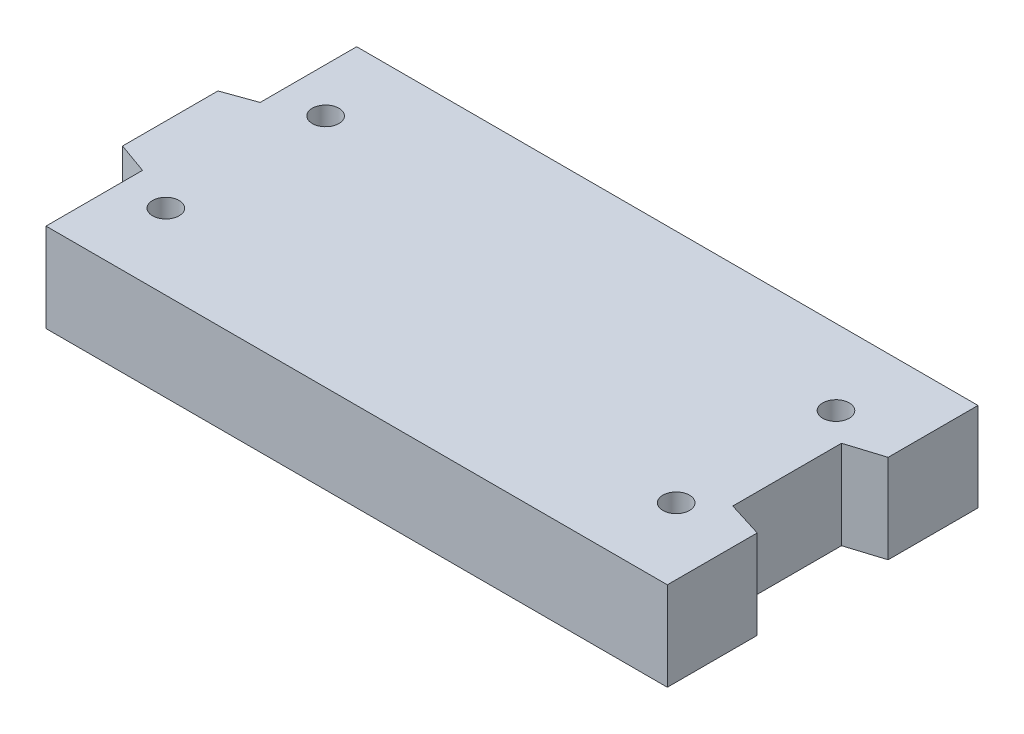
ISO-10303-21;
HEADER;
FILE_DESCRIPTION(('STEP AP214'),'2;1');
FILE_NAME('part.step','',(''),(''),'','','');
FILE_SCHEMA(('AUTOMOTIVE_DESIGN { 1 0 10303 214 1 1 1 1 }'));
ENDSEC;
DATA;
#1=APPLICATION_CONTEXT('core data for automotive mechanical design processes');
#2=APPLICATION_PROTOCOL_DEFINITION('international standard','automotive_design',2000,#1);
#3=PRODUCT_CONTEXT('',#1,'mechanical');
#4=PRODUCT('Part','Part','',(#3));
#5=PRODUCT_RELATED_PRODUCT_CATEGORY('part','',(#4));
#6=PRODUCT_DEFINITION_FORMATION('','',#4);
#7=PRODUCT_DEFINITION_CONTEXT('part definition',#1,'design');
#8=PRODUCT_DEFINITION('design','',#6,#7);
#9=PRODUCT_DEFINITION_SHAPE('','',#8);
#10=(LENGTH_UNIT() NAMED_UNIT(*) SI_UNIT(.MILLI.,.METRE.));
#11=(NAMED_UNIT(*) PLANE_ANGLE_UNIT() SI_UNIT($,.RADIAN.));
#12=(NAMED_UNIT(*) SI_UNIT($,.STERADIAN.) SOLID_ANGLE_UNIT());
#13=UNCERTAINTY_MEASURE_WITH_UNIT(LENGTH_MEASURE(1.E-05),#10,'distance_accuracy_value','');
#14=(GEOMETRIC_REPRESENTATION_CONTEXT(3) GLOBAL_UNCERTAINTY_ASSIGNED_CONTEXT((#13)) GLOBAL_UNIT_ASSIGNED_CONTEXT((#10,
#11,#12)) REPRESENTATION_CONTEXT('',''));
#15=CARTESIAN_POINT('',(0.,0.,0.));
#16=DIRECTION('',(0.,0.,1.));
#17=DIRECTION('',(1.,0.,0.));
#18=AXIS2_PLACEMENT_3D('',#15,#16,#17);
#19=CARTESIAN_POINT('',(115.347513913825,40.,24.5));
#20=DIRECTION('',(-0.298274993135947,0.,0.95447997803503));
#21=DIRECTION('',(0.95447997803503,0.,0.298274993135947));
#22=AXIS2_PLACEMENT_3D('',#19,#20,#21);
#23=PLANE('',#22);
#24=DIRECTION('',(-0.95447997803503,0.,-0.298274993135947));
#25=VECTOR('',#24,1.);
#26=CARTESIAN_POINT('',(115.347513913825,0.,24.5));
#27=LINE('',#26,#25);
#28=CARTESIAN_POINT('',(131.347513913825,0.,29.5));
#29=VERTEX_POINT('',#28);
#30=CARTESIAN_POINT('',(115.347513913825,0.,24.5));
#31=VERTEX_POINT('',#30);
#32=EDGE_CURVE('E166',#29,#31,#27,.T.);
#33=ORIENTED_EDGE('',*,*,#32,.T.);
#34=DIRECTION('',(0.,-1.,0.));
#35=VECTOR('',#34,1.);
#36=CARTESIAN_POINT('',(115.347513913825,40.,24.5));
#37=LINE('',#36,#35);
#38=CARTESIAN_POINT('',(115.347513913825,40.,24.5));
#39=VERTEX_POINT('',#38);
#40=EDGE_CURVE('E219',#39,#31,#37,.T.);
#41=ORIENTED_EDGE('',*,*,#40,.F.);
#42=DIRECTION('',(-0.95447997803503,0.,-0.298274993135947));
#43=VECTOR('',#42,1.);
#44=CARTESIAN_POINT('',(115.347513913825,40.,24.5));
#45=LINE('',#44,#43);
#46=CARTESIAN_POINT('',(131.347513913825,40.,29.5));
#47=VERTEX_POINT('',#46);
#48=EDGE_CURVE('E194',#47,#39,#45,.T.);
#49=ORIENTED_EDGE('',*,*,#48,.F.);
#50=DIRECTION('',(0.,-1.,0.));
#51=VECTOR('',#50,1.);
#52=CARTESIAN_POINT('',(131.347513913825,40.,29.5));
#53=LINE('',#52,#51);
#54=EDGE_CURVE('E162',#47,#29,#53,.T.);
#55=ORIENTED_EDGE('',*,*,#54,.T.);
#56=EDGE_LOOP('',(#33,#41,#49,#55));
#57=FACE_BOUND('',#56,.T.);
#58=ADVANCED_FACE('F41',(#57),#23,.F.);
#59=CARTESIAN_POINT('',(115.347513913825,40.,-24.5));
#60=DIRECTION('',(-1.,0.,0.));
#61=DIRECTION('',(0.,0.,1.));
#62=AXIS2_PLACEMENT_3D('',#59,#60,#61);
#63=PLANE('',#62);
#64=DIRECTION('',(0.,0.,-1.));
#65=VECTOR('',#64,1.);
#66=CARTESIAN_POINT('',(115.347513913825,0.,-24.5));
#67=LINE('',#66,#65);
#68=CARTESIAN_POINT('',(115.347513913825,0.,-24.5));
#69=VERTEX_POINT('',#68);
#70=EDGE_CURVE('E169',#31,#69,#67,.T.);
#71=ORIENTED_EDGE('',*,*,#70,.T.);
#72=DIRECTION('',(0.,-1.,0.));
#73=VECTOR('',#72,1.);
#74=CARTESIAN_POINT('',(115.347513913825,40.,-24.5));
#75=LINE('',#74,#73);
#76=CARTESIAN_POINT('',(115.347513913825,40.,-24.5));
#77=VERTEX_POINT('',#76);
#78=EDGE_CURVE('E216',#77,#69,#75,.T.);
#79=ORIENTED_EDGE('',*,*,#78,.F.);
#80=DIRECTION('',(0.,0.,-1.));
#81=VECTOR('',#80,1.);
#82=CARTESIAN_POINT('',(115.347513913825,40.,-24.5));
#83=LINE('',#82,#81);
#84=EDGE_CURVE('E112',#39,#77,#83,.T.);
#85=ORIENTED_EDGE('',*,*,#84,.F.);
#86=ORIENTED_EDGE('',*,*,#40,.T.);
#87=EDGE_LOOP('',(#71,#79,#85,#86));
#88=FACE_BOUND('',#87,.T.);
#89=ADVANCED_FACE('F258',(#88),#63,.F.);
#90=CARTESIAN_POINT('',(115.347513913825,40.,-24.5));
#91=DIRECTION('',(-0.298274993135947,0.,-0.95447997803503));
#92=DIRECTION('',(-0.95447997803503,0.,0.298274993135947));
#93=AXIS2_PLACEMENT_3D('',#90,#91,#92);
#94=PLANE('',#93);
#95=DIRECTION('',(0.95447997803503,0.,-0.298274993135947));
#96=VECTOR('',#95,1.);
#97=CARTESIAN_POINT('',(115.347513913825,0.,-24.5));
#98=LINE('',#97,#96);
#99=CARTESIAN_POINT('',(131.347513913825,0.,-29.5));
#100=VERTEX_POINT('',#99);
#101=EDGE_CURVE('E172',#69,#100,#98,.T.);
#102=ORIENTED_EDGE('',*,*,#101,.T.);
#103=DIRECTION('',(0.,-1.,0.));
#104=VECTOR('',#103,1.);
#105=CARTESIAN_POINT('',(131.347513913825,40.,-29.5));
#106=LINE('',#105,#104);
#107=CARTESIAN_POINT('',(131.347513913825,40.,-29.5));
#108=VERTEX_POINT('',#107);
#109=EDGE_CURVE('E213',#108,#100,#106,.T.);
#110=ORIENTED_EDGE('',*,*,#109,.F.);
#111=DIRECTION('',(0.95447997803503,0.,-0.298274993135947));
#112=VECTOR('',#111,1.);
#113=CARTESIAN_POINT('',(115.347513913825,40.,-24.5));
#114=LINE('',#113,#112);
#115=EDGE_CURVE('E346',#77,#108,#114,.T.);
#116=ORIENTED_EDGE('',*,*,#115,.F.);
#117=ORIENTED_EDGE('',*,*,#78,.T.);
#118=EDGE_LOOP('',(#102,#110,#116,#117));
#119=FACE_BOUND('',#118,.T.);
#120=ADVANCED_FACE('F264',(#119),#94,.F.);
#121=CARTESIAN_POINT('',(131.347513913825,40.,-70.));
#122=DIRECTION('',(-1.,0.,0.));
#123=DIRECTION('',(0.,0.,1.));
#124=AXIS2_PLACEMENT_3D('',#121,#122,#123);
#125=PLANE('',#124);
#126=DIRECTION('',(0.,0.,-1.));
#127=VECTOR('',#126,1.);
#128=CARTESIAN_POINT('',(131.347513913825,0.,-70.));
#129=LINE('',#128,#127);
#130=CARTESIAN_POINT('',(131.347513913825,0.,-70.));
#131=VERTEX_POINT('',#130);
#132=EDGE_CURVE('E175',#100,#131,#129,.T.);
#133=ORIENTED_EDGE('',*,*,#132,.T.);
#134=DIRECTION('',(0.,-1.,0.));
#135=VECTOR('',#134,1.);
#136=CARTESIAN_POINT('',(131.347513913825,40.,-70.));
#137=LINE('',#136,#135);
#138=CARTESIAN_POINT('',(131.347513913825,40.,-70.));
#139=VERTEX_POINT('',#138);
#140=EDGE_CURVE('E210',#139,#131,#137,.T.);
#141=ORIENTED_EDGE('',*,*,#140,.F.);
#142=DIRECTION('',(0.,0.,-1.));
#143=VECTOR('',#142,1.);
#144=CARTESIAN_POINT('',(131.347513913825,40.,-29.5));
#145=LINE('',#144,#143);
#146=EDGE_CURVE('E343',#108,#139,#145,.T.);
#147=ORIENTED_EDGE('',*,*,#146,.F.);
#148=ORIENTED_EDGE('',*,*,#109,.T.);
#149=EDGE_LOOP('',(#133,#141,#147,#148));
#150=FACE_BOUND('',#149,.T.);
#151=ADVANCED_FACE('F330',(#150),#125,.F.);
#152=CARTESIAN_POINT('',(-144.652486086175,40.,-70.));
#153=DIRECTION('',(0.,0.,1.));
#154=DIRECTION('',(1.,0.,0.));
#155=AXIS2_PLACEMENT_3D('',#152,#153,#154);
#156=PLANE('',#155);
#157=DIRECTION('',(-1.,0.,0.));
#158=VECTOR('',#157,1.);
#159=CARTESIAN_POINT('',(-144.652486086175,0.,-70.));
#160=LINE('',#159,#158);
#161=CARTESIAN_POINT('',(-148.652486086175,0.,-70.));
#162=VERTEX_POINT('',#161);
#163=EDGE_CURVE('E178',#131,#162,#160,.T.);
#164=ORIENTED_EDGE('',*,*,#163,.T.);
#165=DIRECTION('',(0.,-1.,0.));
#166=VECTOR('',#165,1.);
#167=CARTESIAN_POINT('',(-148.652486086175,40.,-70.));
#168=LINE('',#167,#166);
#169=CARTESIAN_POINT('',(-148.652486086175,40.,-70.));
#170=VERTEX_POINT('',#169);
#171=EDGE_CURVE('E207',#170,#162,#168,.T.);
#172=ORIENTED_EDGE('',*,*,#171,.F.);
#173=DIRECTION('',(-1.,0.,0.));
#174=VECTOR('',#173,1.);
#175=CARTESIAN_POINT('',(127.347513913825,40.,-70.));
#176=LINE('',#175,#174);
#177=EDGE_CURVE('E345',#139,#170,#176,.T.);
#178=ORIENTED_EDGE('',*,*,#177,.F.);
#179=ORIENTED_EDGE('',*,*,#140,.T.);
#180=EDGE_LOOP('',(#164,#172,#178,#179));
#181=FACE_BOUND('',#180,.T.);
#182=ADVANCED_FACE('F326',(#181),#156,.F.);
#183=CARTESIAN_POINT('',(-148.652486086175,40.,-26.5));
#184=DIRECTION('',(1.,0.,0.));
#185=DIRECTION('',(0.,0.,-1.));
#186=AXIS2_PLACEMENT_3D('',#183,#184,#185);
#187=PLANE('',#186);
#188=DIRECTION('',(0.,0.,1.));
#189=VECTOR('',#188,1.);
#190=CARTESIAN_POINT('',(-148.652486086175,0.,-26.5));
#191=LINE('',#190,#189);
#192=CARTESIAN_POINT('',(-148.652486086175,0.,-26.5));
#193=VERTEX_POINT('',#192);
#194=EDGE_CURVE('E181',#162,#193,#191,.T.);
#195=ORIENTED_EDGE('',*,*,#194,.T.);
#196=DIRECTION('',(0.,-1.,0.));
#197=VECTOR('',#196,1.);
#198=CARTESIAN_POINT('',(-148.652486086175,40.,-26.5));
#199=LINE('',#198,#197);
#200=CARTESIAN_POINT('',(-148.652486086175,40.,-26.5));
#201=VERTEX_POINT('',#200);
#202=EDGE_CURVE('E204',#201,#193,#199,.T.);
#203=ORIENTED_EDGE('',*,*,#202,.F.);
#204=DIRECTION('',(0.,0.,1.));
#205=VECTOR('',#204,1.);
#206=CARTESIAN_POINT('',(-148.652486086175,40.,-70.));
#207=LINE('',#206,#205);
#208=EDGE_CURVE('E348',#170,#201,#207,.T.);
#209=ORIENTED_EDGE('',*,*,#208,.F.);
#210=ORIENTED_EDGE('',*,*,#171,.T.);
#211=EDGE_LOOP('',(#195,#203,#209,#210));
#212=FACE_BOUND('',#211,.T.);
#213=ADVANCED_FACE('F322',(#212),#187,.F.);
#214=CARTESIAN_POINT('',(-162.652486086175,40.,-21.5));
#215=DIRECTION('',(0.336336396998156,0.,0.941741911594837));
#216=DIRECTION('',(0.941741911594837,0.,-0.336336396998156));
#217=AXIS2_PLACEMENT_3D('',#214,#215,#216);
#218=PLANE('',#217);
#219=DIRECTION('',(-0.941741911594837,0.,0.336336396998156));
#220=VECTOR('',#219,1.);
#221=CARTESIAN_POINT('',(-162.652486086175,0.,-21.5));
#222=LINE('',#221,#220);
#223=CARTESIAN_POINT('',(-162.652486086175,0.,-21.5));
#224=VERTEX_POINT('',#223);
#225=EDGE_CURVE('E183',#193,#224,#222,.T.);
#226=ORIENTED_EDGE('',*,*,#225,.T.);
#227=DIRECTION('',(0.,-1.,0.));
#228=VECTOR('',#227,1.);
#229=CARTESIAN_POINT('',(-162.652486086175,40.,-21.5));
#230=LINE('',#229,#228);
#231=CARTESIAN_POINT('',(-162.652486086175,40.,-21.5));
#232=VERTEX_POINT('',#231);
#233=EDGE_CURVE('E201',#232,#224,#230,.T.);
#234=ORIENTED_EDGE('',*,*,#233,.F.);
#235=DIRECTION('',(-0.941741911594837,0.,0.336336396998156));
#236=VECTOR('',#235,1.);
#237=CARTESIAN_POINT('',(-162.652486086175,40.,-21.5));
#238=LINE('',#237,#236);
#239=EDGE_CURVE('E354',#201,#232,#238,.T.);
#240=ORIENTED_EDGE('',*,*,#239,.F.);
#241=ORIENTED_EDGE('',*,*,#202,.T.);
#242=EDGE_LOOP('',(#226,#234,#240,#241));
#243=FACE_BOUND('',#242,.T.);
#244=ADVANCED_FACE('F318',(#243),#218,.F.);
#245=CARTESIAN_POINT('',(-162.652486086175,40.,-21.5));
#246=DIRECTION('',(1.,0.,0.));
#247=DIRECTION('',(0.,0.,-1.));
#248=AXIS2_PLACEMENT_3D('',#245,#246,#247);
#249=PLANE('',#248);
#250=DIRECTION('',(0.,0.,1.));
#251=VECTOR('',#250,1.);
#252=CARTESIAN_POINT('',(-162.652486086175,0.,-21.5));
#253=LINE('',#252,#251);
#254=CARTESIAN_POINT('',(-162.652486086175,0.,21.5));
#255=VERTEX_POINT('',#254);
#256=EDGE_CURVE('E185',#224,#255,#253,.T.);
#257=ORIENTED_EDGE('',*,*,#256,.T.);
#258=DIRECTION('',(0.,-1.,0.));
#259=VECTOR('',#258,1.);
#260=CARTESIAN_POINT('',(-162.652486086175,40.,21.5));
#261=LINE('',#260,#259);
#262=CARTESIAN_POINT('',(-162.652486086175,40.,21.5));
#263=VERTEX_POINT('',#262);
#264=EDGE_CURVE('E198',#263,#255,#261,.T.);
#265=ORIENTED_EDGE('',*,*,#264,.F.);
#266=DIRECTION('',(0.,0.,1.));
#267=VECTOR('',#266,1.);
#268=CARTESIAN_POINT('',(-162.652486086175,40.,-21.5));
#269=LINE('',#268,#267);
#270=EDGE_CURVE('E356',#232,#263,#269,.T.);
#271=ORIENTED_EDGE('',*,*,#270,.F.);
#272=ORIENTED_EDGE('',*,*,#233,.T.);
#273=EDGE_LOOP('',(#257,#265,#271,#272));
#274=FACE_BOUND('',#273,.T.);
#275=ADVANCED_FACE('F314',(#274),#249,.F.);
#276=CARTESIAN_POINT('',(-162.652486086175,40.,21.5));
#277=DIRECTION('',(0.336336396998156,0.,-0.941741911594837));
#278=DIRECTION('',(-0.941741911594837,0.,-0.336336396998156));
#279=AXIS2_PLACEMENT_3D('',#276,#277,#278);
#280=PLANE('',#279);
#281=DIRECTION('',(0.941741911594837,0.,0.336336396998156));
#282=VECTOR('',#281,1.);
#283=CARTESIAN_POINT('',(-162.652486086175,0.,21.5));
#284=LINE('',#283,#282);
#285=CARTESIAN_POINT('',(-148.652486086175,0.,26.5));
#286=VERTEX_POINT('',#285);
#287=EDGE_CURVE('E187',#255,#286,#284,.T.);
#288=ORIENTED_EDGE('',*,*,#287,.T.);
#289=DIRECTION('',(0.,-1.,0.));
#290=VECTOR('',#289,1.);
#291=CARTESIAN_POINT('',(-148.652486086175,40.,26.5));
#292=LINE('',#291,#290);
#293=CARTESIAN_POINT('',(-148.652486086175,40.,26.5));
#294=VERTEX_POINT('',#293);
#295=EDGE_CURVE('E157',#294,#286,#292,.T.);
#296=ORIENTED_EDGE('',*,*,#295,.F.);
#297=DIRECTION('',(0.941741911594837,0.,0.336336396998156));
#298=VECTOR('',#297,1.);
#299=CARTESIAN_POINT('',(-162.652486086175,40.,21.5));
#300=LINE('',#299,#298);
#301=EDGE_CURVE('E146',#263,#294,#300,.T.);
#302=ORIENTED_EDGE('',*,*,#301,.F.);
#303=ORIENTED_EDGE('',*,*,#264,.T.);
#304=EDGE_LOOP('',(#288,#296,#302,#303));
#305=FACE_BOUND('',#304,.T.);
#306=ADVANCED_FACE('F311',(#305),#280,.F.);
#307=CARTESIAN_POINT('',(-148.652486086175,40.,66.));
#308=DIRECTION('',(1.,0.,0.));
#309=DIRECTION('',(0.,0.,-1.));
#310=AXIS2_PLACEMENT_3D('',#307,#308,#309);
#311=PLANE('',#310);
#312=DIRECTION('',(0.,0.,1.));
#313=VECTOR('',#312,1.);
#314=CARTESIAN_POINT('',(-148.652486086175,0.,66.));
#315=LINE('',#314,#313);
#316=CARTESIAN_POINT('',(-148.652486086175,0.,70.));
#317=VERTEX_POINT('',#316);
#318=EDGE_CURVE('E155',#286,#317,#315,.T.);
#319=ORIENTED_EDGE('',*,*,#318,.T.);
#320=DIRECTION('',(0.,-1.,0.));
#321=VECTOR('',#320,1.);
#322=CARTESIAN_POINT('',(-148.652486086175,40.,70.));
#323=LINE('',#322,#321);
#324=CARTESIAN_POINT('',(-148.652486086175,40.,70.));
#325=VERTEX_POINT('',#324);
#326=EDGE_CURVE('E153',#325,#317,#323,.T.);
#327=ORIENTED_EDGE('',*,*,#326,.F.);
#328=DIRECTION('',(0.,0.,1.));
#329=VECTOR('',#328,1.);
#330=CARTESIAN_POINT('',(-148.652486086175,40.,26.5));
#331=LINE('',#330,#329);
#332=EDGE_CURVE('E139',#294,#325,#331,.T.);
#333=ORIENTED_EDGE('',*,*,#332,.F.);
#334=ORIENTED_EDGE('',*,*,#295,.T.);
#335=EDGE_LOOP('',(#319,#327,#333,#334));
#336=FACE_BOUND('',#335,.T.);
#337=ADVANCED_FACE('F154',(#336),#311,.F.);
#338=CARTESIAN_POINT('',(127.347513913825,40.,70.));
#339=DIRECTION('',(0.,0.,-1.));
#340=DIRECTION('',(-1.,0.,0.));
#341=AXIS2_PLACEMENT_3D('',#338,#339,#340);
#342=PLANE('',#341);
#343=DIRECTION('',(1.,0.,0.));
#344=VECTOR('',#343,1.);
#345=CARTESIAN_POINT('',(127.347513913825,0.,70.));
#346=LINE('',#345,#344);
#347=CARTESIAN_POINT('',(131.347513913825,0.,70.));
#348=VERTEX_POINT('',#347);
#349=EDGE_CURVE('E191',#317,#348,#346,.T.);
#350=ORIENTED_EDGE('',*,*,#349,.T.);
#351=DIRECTION('',(0.,-1.,0.));
#352=VECTOR('',#351,1.);
#353=CARTESIAN_POINT('',(131.347513913825,40.,70.));
#354=LINE('',#353,#352);
#355=CARTESIAN_POINT('',(131.347513913825,40.,70.));
#356=VERTEX_POINT('',#355);
#357=EDGE_CURVE('E158',#356,#348,#354,.T.);
#358=ORIENTED_EDGE('',*,*,#357,.F.);
#359=DIRECTION('',(1.,0.,0.));
#360=VECTOR('',#359,1.);
#361=CARTESIAN_POINT('',(-148.652486086175,40.,70.));
#362=LINE('',#361,#360);
#363=EDGE_CURVE('E143',#325,#356,#362,.T.);
#364=ORIENTED_EDGE('',*,*,#363,.F.);
#365=ORIENTED_EDGE('',*,*,#326,.T.);
#366=EDGE_LOOP('',(#350,#358,#364,#365));
#367=FACE_BOUND('',#366,.T.);
#368=ADVANCED_FACE('F160',(#367),#342,.F.);
#369=CARTESIAN_POINT('',(131.347513913825,40.,29.5));
#370=DIRECTION('',(-1.,0.,0.));
#371=DIRECTION('',(0.,0.,1.));
#372=AXIS2_PLACEMENT_3D('',#369,#370,#371);
#373=PLANE('',#372);
#374=DIRECTION('',(0.,0.,-1.));
#375=VECTOR('',#374,1.);
#376=CARTESIAN_POINT('',(131.347513913825,0.,29.5));
#377=LINE('',#376,#375);
#378=EDGE_CURVE('E99',#348,#29,#377,.T.);
#379=ORIENTED_EDGE('',*,*,#378,.T.);
#380=ORIENTED_EDGE('',*,*,#54,.F.);
#381=DIRECTION('',(0.,0.,-1.));
#382=VECTOR('',#381,1.);
#383=CARTESIAN_POINT('',(131.347513913825,40.,70.));
#384=LINE('',#383,#382);
#385=EDGE_CURVE('E58',#356,#47,#384,.T.);
#386=ORIENTED_EDGE('',*,*,#385,.F.);
#387=ORIENTED_EDGE('',*,*,#357,.T.);
#388=EDGE_LOOP('',(#379,#380,#386,#387));
#389=FACE_BOUND('',#388,.T.);
#390=ADVANCED_FACE('F301',(#389),#373,.F.);
#391=CARTESIAN_POINT('',(131.347513913825,40.,29.5));
#392=DIRECTION('',(0.,-1.,0.));
#393=DIRECTION('',(0.,0.,-1.));
#394=AXIS2_PLACEMENT_3D('',#391,#392,#393);
#395=PLANE('',#394);
#396=CARTESIAN_POINT('',(-128.652486086175,40.,-36.));
#397=DIRECTION('',(0.,1.,0.));
#398=DIRECTION('',(0.,0.,1.));
#399=AXIS2_PLACEMENT_3D('',#396,#397,#398);
#400=CIRCLE('',#399,5.99999999999999);
#401=CARTESIAN_POINT('',(-128.652486086175,40.,-30.));
#402=VERTEX_POINT('',#401);
#403=EDGE_CURVE('E412',#402,#402,#400,.T.);
#404=ORIENTED_EDGE('',*,*,#403,.F.);
#405=EDGE_LOOP('',(#404));
#406=FACE_BOUND('',#405,.T.);
#407=CARTESIAN_POINT('',(101.347513913825,40.,-36.));
#408=DIRECTION('',(0.,1.,0.));
#409=DIRECTION('',(0.,0.,1.));
#410=AXIS2_PLACEMENT_3D('',#407,#408,#409);
#411=CIRCLE('',#410,5.99999999999999);
#412=CARTESIAN_POINT('',(101.347513913825,40.,-30.));
#413=VERTEX_POINT('',#412);
#414=EDGE_CURVE('E400',#413,#413,#411,.T.);
#415=ORIENTED_EDGE('',*,*,#414,.F.);
#416=EDGE_LOOP('',(#415));
#417=FACE_BOUND('',#416,.T.);
#418=CARTESIAN_POINT('',(101.347513913825,40.,36.));
#419=DIRECTION('',(0.,1.,0.));
#420=DIRECTION('',(0.,0.,1.));
#421=AXIS2_PLACEMENT_3D('',#418,#419,#420);
#422=CIRCLE('',#421,5.99999999999999);
#423=CARTESIAN_POINT('',(101.347513913825,40.,42.));
#424=VERTEX_POINT('',#423);
#425=EDGE_CURVE('E388',#424,#424,#422,.T.);
#426=ORIENTED_EDGE('',*,*,#425,.F.);
#427=EDGE_LOOP('',(#426));
#428=FACE_BOUND('',#427,.T.);
#429=CARTESIAN_POINT('',(-128.652486086175,40.,36.));
#430=DIRECTION('',(0.,1.,0.));
#431=DIRECTION('',(0.,0.,1.));
#432=AXIS2_PLACEMENT_3D('',#429,#430,#431);
#433=CIRCLE('',#432,5.99999999999999);
#434=CARTESIAN_POINT('',(-128.652486086175,40.,42.));
#435=VERTEX_POINT('',#434);
#436=EDGE_CURVE('E376',#435,#435,#433,.T.);
#437=ORIENTED_EDGE('',*,*,#436,.F.);
#438=EDGE_LOOP('',(#437));
#439=FACE_BOUND('',#438,.T.);
#440=ORIENTED_EDGE('',*,*,#48,.T.);
#441=ORIENTED_EDGE('',*,*,#84,.T.);
#442=ORIENTED_EDGE('',*,*,#115,.T.);
#443=ORIENTED_EDGE('',*,*,#146,.T.);
#444=ORIENTED_EDGE('',*,*,#177,.T.);
#445=ORIENTED_EDGE('',*,*,#208,.T.);
#446=ORIENTED_EDGE('',*,*,#239,.T.);
#447=ORIENTED_EDGE('',*,*,#270,.T.);
#448=ORIENTED_EDGE('',*,*,#301,.T.);
#449=ORIENTED_EDGE('',*,*,#332,.T.);
#450=ORIENTED_EDGE('',*,*,#363,.T.);
#451=ORIENTED_EDGE('',*,*,#385,.T.);
#452=EDGE_LOOP('',(#440,#441,#442,#443,#444,#445,#446,#447,#448,#449,#450,#451));
#453=FACE_BOUND('',#452,.T.);
#454=ADVANCED_FACE('F141',(#406,#417,#428,#439,#453),#395,.F.);
#455=CARTESIAN_POINT('',(131.347513913825,0.,29.5));
#456=DIRECTION('',(0.,-1.,0.));
#457=DIRECTION('',(0.,0.,-1.));
#458=AXIS2_PLACEMENT_3D('',#455,#456,#457);
#459=PLANE('',#458);
#460=CARTESIAN_POINT('',(60.3475139138251,0.,0.));
#461=DIRECTION('',(0.,-1.,0.));
#462=DIRECTION('',(0.,0.,-1.));
#463=AXIS2_PLACEMENT_3D('',#460,#461,#462);
#464=CIRCLE('',#463,42.1612107824225);
#465=CARTESIAN_POINT('',(60.3475139138251,0.,-42.1612107824225));
#466=VERTEX_POINT('',#465);
#467=EDGE_CURVE('E236',#466,#466,#464,.F.);
#468=ORIENTED_EDGE('',*,*,#467,.T.);
#469=EDGE_LOOP('',(#468));
#470=FACE_BOUND('',#469,.T.);
#471=CARTESIAN_POINT('',(-80.6524860861749,0.,0.));
#472=DIRECTION('',(0.,-1.,0.));
#473=DIRECTION('',(0.,0.,-1.));
#474=AXIS2_PLACEMENT_3D('',#471,#472,#473);
#475=CIRCLE('',#474,42.1612107824225);
#476=CARTESIAN_POINT('',(-80.6524860861749,0.,-42.1612107824225));
#477=VERTEX_POINT('',#476);
#478=EDGE_CURVE('E224',#477,#477,#475,.F.);
#479=ORIENTED_EDGE('',*,*,#478,.T.);
#480=EDGE_LOOP('',(#479));
#481=FACE_BOUND('',#480,.T.);
#482=ORIENTED_EDGE('',*,*,#32,.F.);
#483=ORIENTED_EDGE('',*,*,#378,.F.);
#484=ORIENTED_EDGE('',*,*,#349,.F.);
#485=ORIENTED_EDGE('',*,*,#318,.F.);
#486=ORIENTED_EDGE('',*,*,#287,.F.);
#487=ORIENTED_EDGE('',*,*,#256,.F.);
#488=ORIENTED_EDGE('',*,*,#225,.F.);
#489=ORIENTED_EDGE('',*,*,#194,.F.);
#490=ORIENTED_EDGE('',*,*,#163,.F.);
#491=ORIENTED_EDGE('',*,*,#132,.F.);
#492=ORIENTED_EDGE('',*,*,#101,.F.);
#493=ORIENTED_EDGE('',*,*,#70,.F.);
#494=EDGE_LOOP('',(#482,#483,#484,#485,#486,#487,#488,#489,#490,#491,#492,#493));
#495=FACE_BOUND('',#494,.T.);
#496=ADVANCED_FACE('F272',(#470,#481,#495),#459,.T.);
#497=CARTESIAN_POINT('',(-80.6524860861749,0.,0.));
#498=DIRECTION('',(0.,-1.,0.));
#499=DIRECTION('',(0.,0.,-1.));
#500=AXIS2_PLACEMENT_3D('',#497,#498,#499);
#501=CONICAL_SURFACE('',#500,40.25,0.436332312998583);
#502=CARTESIAN_POINT('',(-80.6524860861749,9.61309130870351,0.));
#503=DIRECTION('',(0.,1.,0.));
#504=DIRECTION('',(0.,0.,1.));
#505=AXIS2_PLACEMENT_3D('',#502,#503,#504);
#506=CIRCLE('',#505,35.7673419042083);
#507=CARTESIAN_POINT('',(-80.6524860861749,9.61309130870351,35.7673419042083));
#508=VERTEX_POINT('',#507);
#509=EDGE_CURVE('E230',#508,#508,#506,.T.);
#510=ORIENTED_EDGE('',*,*,#509,.T.);
#511=EDGE_LOOP('',(#510));
#512=FACE_BOUND('',#511,.T.);
#513=CARTESIAN_POINT('',(-80.6524860861749,1.7321452147779,0.));
#514=DIRECTION('',(0.,-1.,0.));
#515=DIRECTION('',(0.,0.,-1.));
#516=AXIS2_PLACEMENT_3D('',#513,#514,#515);
#517=CIRCLE('',#516,39.4422874213125);
#518=CARTESIAN_POINT('',(-80.6524860861749,1.7321452147779,-39.4422874213125));
#519=VERTEX_POINT('',#518);
#520=EDGE_CURVE('E221',#519,#519,#517,.T.);
#521=ORIENTED_EDGE('',*,*,#520,.T.);
#522=EDGE_LOOP('',(#521));
#523=FACE_BOUND('',#522,.T.);
#524=ADVANCED_FACE('F268',(#512,#523),#501,.F.);
#525=CARTESIAN_POINT('',(-80.6524860861749,12.5,0.));
#526=DIRECTION('',(0.,-1.,0.));
#527=DIRECTION('',(0.,0.,-1.));
#528=AXIS2_PLACEMENT_3D('',#525,#526,#527);
#529=PLANE('',#528);
#530=CARTESIAN_POINT('',(-80.6524860861749,12.5,0.));
#531=DIRECTION('',(0.,-1.,0.));
#532=DIRECTION('',(0.,0.,-1.));
#533=AXIS2_PLACEMENT_3D('',#530,#531,#532);
#534=CIRCLE('',#533,31.2358029690251);
#535=CARTESIAN_POINT('',(-80.6524860861749,12.5,-31.2358029690251));
#536=VERTEX_POINT('',#535);
#537=EDGE_CURVE('E227',#536,#536,#534,.T.);
#538=ORIENTED_EDGE('',*,*,#537,.T.);
#539=EDGE_LOOP('',(#538));
#540=FACE_BOUND('',#539,.T.);
#541=ADVANCED_FACE('F271',(#540),#529,.T.);
#542=CARTESIAN_POINT('',(-80.6524860861749,3.,0.));
#543=DIRECTION('',(0.,-1.,0.));
#544=DIRECTION('',(0.,0.,-1.));
#545=AXIS2_PLACEMENT_3D('',#542,#543,#544);
#546=TOROIDAL_SURFACE('',#545,42.1612107824225,3.);
#547=ORIENTED_EDGE('',*,*,#478,.F.);
#548=EDGE_LOOP('',(#547));
#549=FACE_BOUND('',#548,.T.);
#550=ORIENTED_EDGE('',*,*,#520,.F.);
#551=EDGE_LOOP('',(#550));
#552=FACE_BOUND('',#551,.T.);
#553=ADVANCED_FACE('F274',(#549,#552),#546,.T.);
#554=CARTESIAN_POINT('',(-80.6524860861749,7.5,0.));
#555=DIRECTION('',(0.,-1.,0.));
#556=DIRECTION('',(0.,0.,-1.));
#557=AXIS2_PLACEMENT_3D('',#554,#555,#556);
#558=TOROIDAL_SURFACE('',#557,31.2358029690251,5.);
#559=ORIENTED_EDGE('',*,*,#509,.F.);
#560=EDGE_LOOP('',(#559));
#561=FACE_BOUND('',#560,.T.);
#562=ORIENTED_EDGE('',*,*,#537,.F.);
#563=EDGE_LOOP('',(#562));
#564=FACE_BOUND('',#563,.T.);
#565=ADVANCED_FACE('F277',(#561,#564),#558,.F.);
#566=CARTESIAN_POINT('',(60.3475139138251,0.,0.));
#567=DIRECTION('',(0.,-1.,0.));
#568=DIRECTION('',(0.,0.,-1.));
#569=AXIS2_PLACEMENT_3D('',#566,#567,#568);
#570=CONICAL_SURFACE('',#569,40.25,0.436332312998583);
#571=CARTESIAN_POINT('',(60.3475139138251,9.61309130870351,0.));
#572=DIRECTION('',(0.,1.,0.));
#573=DIRECTION('',(0.,0.,1.));
#574=AXIS2_PLACEMENT_3D('',#571,#572,#573);
#575=CIRCLE('',#574,35.7673419042083);
#576=CARTESIAN_POINT('',(60.3475139138251,9.61309130870351,35.7673419042083));
#577=VERTEX_POINT('',#576);
#578=EDGE_CURVE('E11',#577,#577,#575,.T.);
#579=ORIENTED_EDGE('',*,*,#578,.T.);
#580=EDGE_LOOP('',(#579));
#581=FACE_BOUND('',#580,.T.);
#582=CARTESIAN_POINT('',(60.3475139138251,1.7321452147779,0.));
#583=DIRECTION('',(0.,-1.,0.));
#584=DIRECTION('',(0.,0.,-1.));
#585=AXIS2_PLACEMENT_3D('',#582,#583,#584);
#586=CIRCLE('',#585,39.4422874213125);
#587=CARTESIAN_POINT('',(60.3475139138251,1.7321452147779,-39.4422874213125));
#588=VERTEX_POINT('',#587);
#589=EDGE_CURVE('E233',#588,#588,#586,.T.);
#590=ORIENTED_EDGE('',*,*,#589,.T.);
#591=EDGE_LOOP('',(#590));
#592=FACE_BOUND('',#591,.T.);
#593=ADVANCED_FACE('F281',(#581,#592),#570,.F.);
#594=CARTESIAN_POINT('',(60.3475139138251,12.5,0.));
#595=DIRECTION('',(0.,-1.,0.));
#596=DIRECTION('',(0.,0.,-1.));
#597=AXIS2_PLACEMENT_3D('',#594,#595,#596);
#598=PLANE('',#597);
#599=CARTESIAN_POINT('',(60.3475139138251,12.5,0.));
#600=DIRECTION('',(0.,-1.,0.));
#601=DIRECTION('',(0.,0.,-1.));
#602=AXIS2_PLACEMENT_3D('',#599,#600,#601);
#603=CIRCLE('',#602,31.2358029690251);
#604=CARTESIAN_POINT('',(60.3475139138251,12.5,-31.235802969025));
#605=VERTEX_POINT('',#604);
#606=EDGE_CURVE('E50',#605,#605,#603,.T.);
#607=ORIENTED_EDGE('',*,*,#606,.T.);
#608=EDGE_LOOP('',(#607));
#609=FACE_BOUND('',#608,.T.);
#610=ADVANCED_FACE('F241',(#609),#598,.T.);
#611=CARTESIAN_POINT('',(60.3475139138251,3.,0.));
#612=DIRECTION('',(0.,-1.,0.));
#613=DIRECTION('',(0.,0.,-1.));
#614=AXIS2_PLACEMENT_3D('',#611,#612,#613);
#615=TOROIDAL_SURFACE('',#614,42.1612107824225,3.);
#616=ORIENTED_EDGE('',*,*,#467,.F.);
#617=EDGE_LOOP('',(#616));
#618=FACE_BOUND('',#617,.T.);
#619=ORIENTED_EDGE('',*,*,#589,.F.);
#620=EDGE_LOOP('',(#619));
#621=FACE_BOUND('',#620,.T.);
#622=ADVANCED_FACE('F245',(#618,#621),#615,.T.);
#623=CARTESIAN_POINT('',(60.3475139138251,7.5,0.));
#624=DIRECTION('',(0.,-1.,0.));
#625=DIRECTION('',(0.,0.,-1.));
#626=AXIS2_PLACEMENT_3D('',#623,#624,#625);
#627=TOROIDAL_SURFACE('',#626,31.2358029690251,5.);
#628=ORIENTED_EDGE('',*,*,#578,.F.);
#629=EDGE_LOOP('',(#628));
#630=FACE_BOUND('',#629,.T.);
#631=ORIENTED_EDGE('',*,*,#606,.F.);
#632=EDGE_LOOP('',(#631));
#633=FACE_BOUND('',#632,.T.);
#634=ADVANCED_FACE('F43',(#630,#633),#627,.F.);
#635=CARTESIAN_POINT('',(-128.652486086175,7.25,36.));
#636=DIRECTION('',(0.,1.,0.));
#637=DIRECTION('',(0.,0.,1.));
#638=AXIS2_PLACEMENT_3D('',#635,#636,#637);
#639=CONICAL_SURFACE('',#638,5.09999999999999,1.02974425867665);
#640=CARTESIAN_POINT('',(-128.652486086175,4.18561084295944,36.));
#641=VERTEX_POINT('',#640);
#642=VERTEX_LOOP('',#641);
#643=FACE_BOUND('',#642,.T.);
#644=CARTESIAN_POINT('',(-128.652486086175,7.25,36.));
#645=DIRECTION('',(0.,1.,0.));
#646=DIRECTION('',(0.,0.,1.));
#647=AXIS2_PLACEMENT_3D('',#644,#645,#646);
#648=CIRCLE('',#647,5.09999999999999);
#649=CARTESIAN_POINT('',(-128.652486086175,7.25,41.1));
#650=VERTEX_POINT('',#649);
#651=EDGE_CURVE('E170',#650,#650,#648,.T.);
#652=ORIENTED_EDGE('',*,*,#651,.T.);
#653=EDGE_LOOP('',(#652));
#654=FACE_BOUND('',#653,.T.);
#655=ADVANCED_FACE('F244',(#643,#654),#639,.F.);
#656=CARTESIAN_POINT('',(-128.652486086175,40.,36.));
#657=DIRECTION('',(0.,1.,0.));
#658=DIRECTION('',(0.,0.,1.));
#659=AXIS2_PLACEMENT_3D('',#656,#657,#658);
#660=CYLINDRICAL_SURFACE('',#659,5.09999999999999);
#661=ORIENTED_EDGE('',*,*,#651,.F.);
#662=EDGE_LOOP('',(#661));
#663=FACE_BOUND('',#662,.T.);
#664=CARTESIAN_POINT('',(-128.652486086175,16.,36.));
#665=DIRECTION('',(0.,1.,0.));
#666=DIRECTION('',(0.,0.,1.));
#667=AXIS2_PLACEMENT_3D('',#664,#665,#666);
#668=CIRCLE('',#667,5.09999999999999);
#669=CARTESIAN_POINT('',(-128.652486086175,16.,41.1));
#670=VERTEX_POINT('',#669);
#671=EDGE_CURVE('E370',#670,#670,#668,.T.);
#672=ORIENTED_EDGE('',*,*,#671,.T.);
#673=EDGE_LOOP('',(#672));
#674=FACE_BOUND('',#673,.T.);
#675=ADVANCED_FACE('F252',(#663,#674),#660,.F.);
#676=CARTESIAN_POINT('',(-123.552486086175,16.,36.));
#677=DIRECTION('',(0.,-1.,0.));
#678=DIRECTION('',(0.,0.,-1.));
#679=AXIS2_PLACEMENT_3D('',#676,#677,#678);
#680=PLANE('',#679);
#681=ORIENTED_EDGE('',*,*,#671,.F.);
#682=EDGE_LOOP('',(#681));
#683=FACE_BOUND('',#682,.T.);
#684=CARTESIAN_POINT('',(-128.652486086175,16.,36.));
#685=DIRECTION('',(0.,1.,0.));
#686=DIRECTION('',(0.,0.,1.));
#687=AXIS2_PLACEMENT_3D('',#684,#685,#686);
#688=CIRCLE('',#687,5.99999999999999);
#689=CARTESIAN_POINT('',(-128.652486086175,16.,42.));
#690=VERTEX_POINT('',#689);
#691=EDGE_CURVE('E373',#690,#690,#688,.T.);
#692=ORIENTED_EDGE('',*,*,#691,.T.);
#693=EDGE_LOOP('',(#692));
#694=FACE_BOUND('',#693,.T.);
#695=ADVANCED_FACE('F427',(#683,#694),#680,.F.);
#696=CARTESIAN_POINT('',(-128.652486086175,40.,36.));
#697=DIRECTION('',(0.,1.,0.));
#698=DIRECTION('',(0.,0.,1.));
#699=AXIS2_PLACEMENT_3D('',#696,#697,#698);
#700=CYLINDRICAL_SURFACE('',#699,5.99999999999999);
#701=ORIENTED_EDGE('',*,*,#691,.F.);
#702=EDGE_LOOP('',(#701));
#703=FACE_BOUND('',#702,.T.);
#704=ORIENTED_EDGE('',*,*,#436,.T.);
#705=EDGE_LOOP('',(#704));
#706=FACE_BOUND('',#705,.T.);
#707=ADVANCED_FACE('F424',(#703,#706),#700,.F.);
#708=CARTESIAN_POINT('',(101.347513913825,7.25,36.));
#709=DIRECTION('',(0.,1.,0.));
#710=DIRECTION('',(0.,0.,1.));
#711=AXIS2_PLACEMENT_3D('',#708,#709,#710);
#712=CONICAL_SURFACE('',#711,5.09999999999999,1.02974425867665);
#713=CARTESIAN_POINT('',(101.347513913825,4.18561084295944,36.));
#714=VERTEX_POINT('',#713);
#715=VERTEX_LOOP('',#714);
#716=FACE_BOUND('',#715,.T.);
#717=CARTESIAN_POINT('',(101.347513913825,7.25,36.));
#718=DIRECTION('',(0.,1.,0.));
#719=DIRECTION('',(0.,0.,1.));
#720=AXIS2_PLACEMENT_3D('',#717,#718,#719);
#721=CIRCLE('',#720,5.09999999999999);
#722=CARTESIAN_POINT('',(101.347513913825,7.25,41.1));
#723=VERTEX_POINT('',#722);
#724=EDGE_CURVE('E379',#723,#723,#721,.T.);
#725=ORIENTED_EDGE('',*,*,#724,.T.);
#726=EDGE_LOOP('',(#725));
#727=FACE_BOUND('',#726,.T.);
#728=ADVANCED_FACE('F426',(#716,#727),#712,.F.);
#729=CARTESIAN_POINT('',(101.347513913825,40.,36.));
#730=DIRECTION('',(0.,1.,0.));
#731=DIRECTION('',(0.,0.,1.));
#732=AXIS2_PLACEMENT_3D('',#729,#730,#731);
#733=CYLINDRICAL_SURFACE('',#732,5.09999999999999);
#734=ORIENTED_EDGE('',*,*,#724,.F.);
#735=EDGE_LOOP('',(#734));
#736=FACE_BOUND('',#735,.T.);
#737=CARTESIAN_POINT('',(101.347513913825,16.,36.));
#738=DIRECTION('',(0.,1.,0.));
#739=DIRECTION('',(0.,0.,1.));
#740=AXIS2_PLACEMENT_3D('',#737,#738,#739);
#741=CIRCLE('',#740,5.09999999999999);
#742=CARTESIAN_POINT('',(101.347513913825,16.,41.1));
#743=VERTEX_POINT('',#742);
#744=EDGE_CURVE('E382',#743,#743,#741,.T.);
#745=ORIENTED_EDGE('',*,*,#744,.T.);
#746=EDGE_LOOP('',(#745));
#747=FACE_BOUND('',#746,.T.);
#748=ADVANCED_FACE('F434',(#736,#747),#733,.F.);
#749=CARTESIAN_POINT('',(106.447513913825,16.,36.));
#750=DIRECTION('',(0.,-1.,0.));
#751=DIRECTION('',(0.,0.,-1.));
#752=AXIS2_PLACEMENT_3D('',#749,#750,#751);
#753=PLANE('',#752);
#754=ORIENTED_EDGE('',*,*,#744,.F.);
#755=EDGE_LOOP('',(#754));
#756=FACE_BOUND('',#755,.T.);
#757=CARTESIAN_POINT('',(101.347513913825,16.,36.));
#758=DIRECTION('',(0.,1.,0.));
#759=DIRECTION('',(0.,0.,1.));
#760=AXIS2_PLACEMENT_3D('',#757,#758,#759);
#761=CIRCLE('',#760,5.99999999999999);
#762=CARTESIAN_POINT('',(101.347513913825,16.,42.));
#763=VERTEX_POINT('',#762);
#764=EDGE_CURVE('E385',#763,#763,#761,.T.);
#765=ORIENTED_EDGE('',*,*,#764,.T.);
#766=EDGE_LOOP('',(#765));
#767=FACE_BOUND('',#766,.T.);
#768=ADVANCED_FACE('F477',(#756,#767),#753,.F.);
#769=CARTESIAN_POINT('',(101.347513913825,40.,36.));
#770=DIRECTION('',(0.,1.,0.));
#771=DIRECTION('',(0.,0.,1.));
#772=AXIS2_PLACEMENT_3D('',#769,#770,#771);
#773=CYLINDRICAL_SURFACE('',#772,5.99999999999999);
#774=ORIENTED_EDGE('',*,*,#764,.F.);
#775=EDGE_LOOP('',(#774));
#776=FACE_BOUND('',#775,.T.);
#777=ORIENTED_EDGE('',*,*,#425,.T.);
#778=EDGE_LOOP('',(#777));
#779=FACE_BOUND('',#778,.T.);
#780=ADVANCED_FACE('F486',(#776,#779),#773,.F.);
#781=CARTESIAN_POINT('',(101.347513913825,7.25,-36.));
#782=DIRECTION('',(0.,1.,0.));
#783=DIRECTION('',(0.,0.,1.));
#784=AXIS2_PLACEMENT_3D('',#781,#782,#783);
#785=CONICAL_SURFACE('',#784,5.09999999999999,1.02974425867665);
#786=CARTESIAN_POINT('',(101.347513913825,4.18561084295944,-36.));
#787=VERTEX_POINT('',#786);
#788=VERTEX_LOOP('',#787);
#789=FACE_BOUND('',#788,.T.);
#790=CARTESIAN_POINT('',(101.347513913825,7.25,-36.));
#791=DIRECTION('',(0.,1.,0.));
#792=DIRECTION('',(0.,0.,1.));
#793=AXIS2_PLACEMENT_3D('',#790,#791,#792);
#794=CIRCLE('',#793,5.09999999999999);
#795=CARTESIAN_POINT('',(101.347513913825,7.25,-30.9));
#796=VERTEX_POINT('',#795);
#797=EDGE_CURVE('E391',#796,#796,#794,.T.);
#798=ORIENTED_EDGE('',*,*,#797,.T.);
#799=EDGE_LOOP('',(#798));
#800=FACE_BOUND('',#799,.T.);
#801=ADVANCED_FACE('F496',(#789,#800),#785,.F.);
#802=CARTESIAN_POINT('',(101.347513913825,40.,-36.));
#803=DIRECTION('',(0.,1.,0.));
#804=DIRECTION('',(0.,0.,1.));
#805=AXIS2_PLACEMENT_3D('',#802,#803,#804);
#806=CYLINDRICAL_SURFACE('',#805,5.09999999999999);
#807=ORIENTED_EDGE('',*,*,#797,.F.);
#808=EDGE_LOOP('',(#807));
#809=FACE_BOUND('',#808,.T.);
#810=CARTESIAN_POINT('',(101.347513913825,16.,-36.));
#811=DIRECTION('',(0.,1.,0.));
#812=DIRECTION('',(0.,0.,1.));
#813=AXIS2_PLACEMENT_3D('',#810,#811,#812);
#814=CIRCLE('',#813,5.09999999999999);
#815=CARTESIAN_POINT('',(101.347513913825,16.,-30.9));
#816=VERTEX_POINT('',#815);
#817=EDGE_CURVE('E394',#816,#816,#814,.T.);
#818=ORIENTED_EDGE('',*,*,#817,.T.);
#819=EDGE_LOOP('',(#818));
#820=FACE_BOUND('',#819,.T.);
#821=ADVANCED_FACE('F506',(#809,#820),#806,.F.);
#822=CARTESIAN_POINT('',(106.447513913825,16.,-36.));
#823=DIRECTION('',(0.,-1.,0.));
#824=DIRECTION('',(0.,0.,-1.));
#825=AXIS2_PLACEMENT_3D('',#822,#823,#824);
#826=PLANE('',#825);
#827=ORIENTED_EDGE('',*,*,#817,.F.);
#828=EDGE_LOOP('',(#827));
#829=FACE_BOUND('',#828,.T.);
#830=CARTESIAN_POINT('',(101.347513913825,16.,-36.));
#831=DIRECTION('',(0.,1.,0.));
#832=DIRECTION('',(0.,0.,1.));
#833=AXIS2_PLACEMENT_3D('',#830,#831,#832);
#834=CIRCLE('',#833,5.99999999999999);
#835=CARTESIAN_POINT('',(101.347513913825,16.,-30.));
#836=VERTEX_POINT('',#835);
#837=EDGE_CURVE('E397',#836,#836,#834,.T.);
#838=ORIENTED_EDGE('',*,*,#837,.T.);
#839=EDGE_LOOP('',(#838));
#840=FACE_BOUND('',#839,.T.);
#841=ADVANCED_FACE('F516',(#829,#840),#826,.F.);
#842=CARTESIAN_POINT('',(101.347513913825,40.,-36.));
#843=DIRECTION('',(0.,1.,0.));
#844=DIRECTION('',(0.,0.,1.));
#845=AXIS2_PLACEMENT_3D('',#842,#843,#844);
#846=CYLINDRICAL_SURFACE('',#845,5.99999999999999);
#847=ORIENTED_EDGE('',*,*,#837,.F.);
#848=EDGE_LOOP('',(#847));
#849=FACE_BOUND('',#848,.T.);
#850=ORIENTED_EDGE('',*,*,#414,.T.);
#851=EDGE_LOOP('',(#850));
#852=FACE_BOUND('',#851,.T.);
#853=ADVANCED_FACE('F526',(#849,#852),#846,.F.);
#854=CARTESIAN_POINT('',(-128.652486086175,7.25,-36.));
#855=DIRECTION('',(0.,1.,0.));
#856=DIRECTION('',(0.,0.,1.));
#857=AXIS2_PLACEMENT_3D('',#854,#855,#856);
#858=CONICAL_SURFACE('',#857,5.09999999999999,1.02974425867665);
#859=CARTESIAN_POINT('',(-128.652486086175,4.18561084295944,-36.));
#860=VERTEX_POINT('',#859);
#861=VERTEX_LOOP('',#860);
#862=FACE_BOUND('',#861,.T.);
#863=CARTESIAN_POINT('',(-128.652486086175,7.25,-36.));
#864=DIRECTION('',(0.,1.,0.));
#865=DIRECTION('',(0.,0.,1.));
#866=AXIS2_PLACEMENT_3D('',#863,#864,#865);
#867=CIRCLE('',#866,5.09999999999999);
#868=CARTESIAN_POINT('',(-128.652486086175,7.25,-30.9));
#869=VERTEX_POINT('',#868);
#870=EDGE_CURVE('E403',#869,#869,#867,.T.);
#871=ORIENTED_EDGE('',*,*,#870,.T.);
#872=EDGE_LOOP('',(#871));
#873=FACE_BOUND('',#872,.T.);
#874=ADVANCED_FACE('F536',(#862,#873),#858,.F.);
#875=CARTESIAN_POINT('',(-128.652486086175,40.,-36.));
#876=DIRECTION('',(0.,1.,0.));
#877=DIRECTION('',(0.,0.,1.));
#878=AXIS2_PLACEMENT_3D('',#875,#876,#877);
#879=CYLINDRICAL_SURFACE('',#878,5.09999999999999);
#880=ORIENTED_EDGE('',*,*,#870,.F.);
#881=EDGE_LOOP('',(#880));
#882=FACE_BOUND('',#881,.T.);
#883=CARTESIAN_POINT('',(-128.652486086175,16.,-36.));
#884=DIRECTION('',(0.,1.,0.));
#885=DIRECTION('',(0.,0.,1.));
#886=AXIS2_PLACEMENT_3D('',#883,#884,#885);
#887=CIRCLE('',#886,5.09999999999999);
#888=CARTESIAN_POINT('',(-128.652486086175,16.,-30.9));
#889=VERTEX_POINT('',#888);
#890=EDGE_CURVE('E406',#889,#889,#887,.T.);
#891=ORIENTED_EDGE('',*,*,#890,.T.);
#892=EDGE_LOOP('',(#891));
#893=FACE_BOUND('',#892,.T.);
#894=ADVANCED_FACE('F546',(#882,#893),#879,.F.);
#895=CARTESIAN_POINT('',(-123.552486086175,16.,-36.));
#896=DIRECTION('',(0.,-1.,0.));
#897=DIRECTION('',(0.,0.,-1.));
#898=AXIS2_PLACEMENT_3D('',#895,#896,#897);
#899=PLANE('',#898);
#900=ORIENTED_EDGE('',*,*,#890,.F.);
#901=EDGE_LOOP('',(#900));
#902=FACE_BOUND('',#901,.T.);
#903=CARTESIAN_POINT('',(-128.652486086175,16.,-36.));
#904=DIRECTION('',(0.,1.,0.));
#905=DIRECTION('',(0.,0.,1.));
#906=AXIS2_PLACEMENT_3D('',#903,#904,#905);
#907=CIRCLE('',#906,5.99999999999999);
#908=CARTESIAN_POINT('',(-128.652486086175,16.,-30.));
#909=VERTEX_POINT('',#908);
#910=EDGE_CURVE('E409',#909,#909,#907,.T.);
#911=ORIENTED_EDGE('',*,*,#910,.T.);
#912=EDGE_LOOP('',(#911));
#913=FACE_BOUND('',#912,.T.);
#914=ADVANCED_FACE('F556',(#902,#913),#899,.F.);
#915=CARTESIAN_POINT('',(-128.652486086175,40.,-36.));
#916=DIRECTION('',(0.,1.,0.));
#917=DIRECTION('',(0.,0.,1.));
#918=AXIS2_PLACEMENT_3D('',#915,#916,#917);
#919=CYLINDRICAL_SURFACE('',#918,5.99999999999999);
#920=ORIENTED_EDGE('',*,*,#910,.F.);
#921=EDGE_LOOP('',(#920));
#922=FACE_BOUND('',#921,.T.);
#923=ORIENTED_EDGE('',*,*,#403,.T.);
#924=EDGE_LOOP('',(#923));
#925=FACE_BOUND('',#924,.T.);
#926=ADVANCED_FACE('F416',(#922,#925),#919,.F.);
#927=CLOSED_SHELL('',(#58,#89,#120,#151,#182,#213,#244,#275,#306,#337,#368,#390,#454,#496,#524,
#541,#553,#565,#593,#610,#622,#634,#655,#675,#695,#707,#728,#748,#768,#780,#801,#821,#841,#853,
#874,#894,#914,#926));
#928=MANIFOLD_SOLID_BREP('B2',#927);
#929=ADVANCED_BREP_SHAPE_REPRESENTATION('',(#18,#928),#14);
#930=SHAPE_DEFINITION_REPRESENTATION(#9,#929);
ENDSEC;
END-ISO-10303-21;
